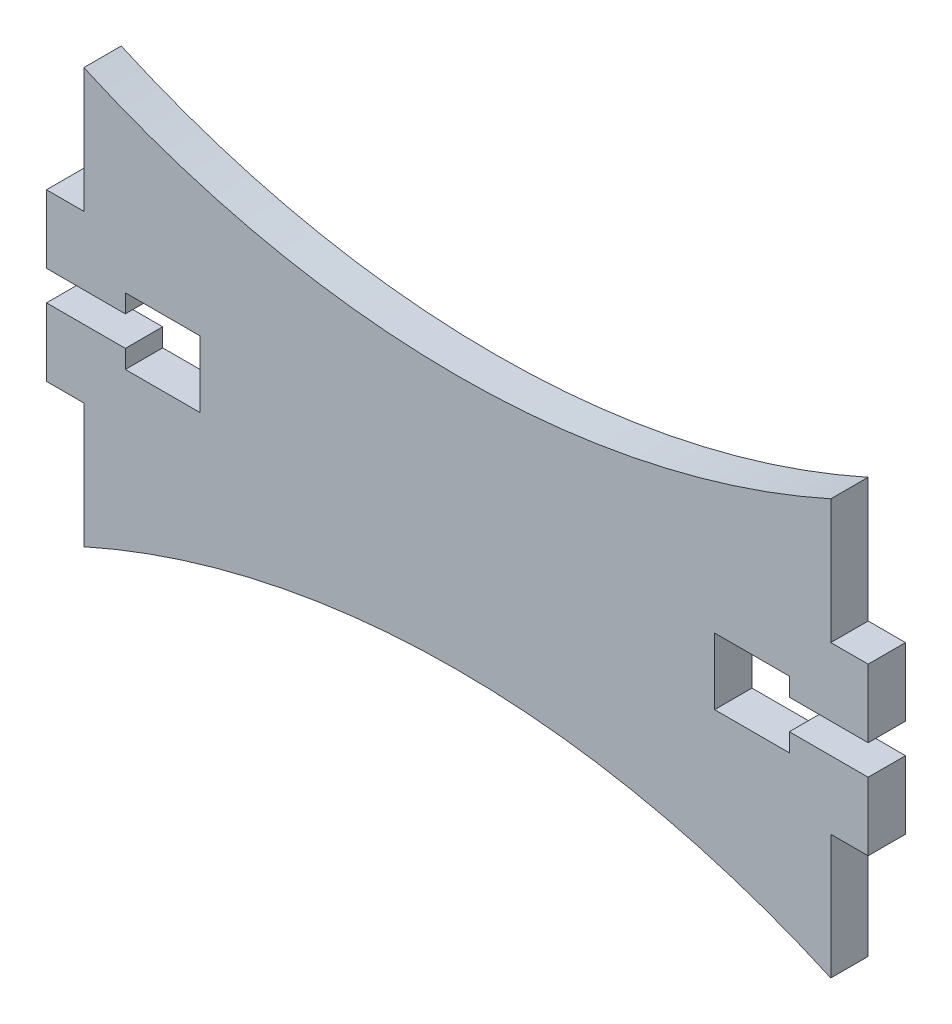
ISO-10303-21;
HEADER;
FILE_DESCRIPTION(('STEP AP214'),'2;1');
FILE_NAME('part.step','',(''),(''),'','','');
FILE_SCHEMA(('AUTOMOTIVE_DESIGN { 1 0 10303 214 1 1 1 1 }'));
ENDSEC;
DATA;
#1=APPLICATION_CONTEXT('core data for automotive mechanical design processes');
#2=APPLICATION_PROTOCOL_DEFINITION('international standard','automotive_design',2000,#1);
#3=PRODUCT_CONTEXT('',#1,'mechanical');
#4=PRODUCT('Part','Part','',(#3));
#5=PRODUCT_RELATED_PRODUCT_CATEGORY('part','',(#4));
#6=PRODUCT_DEFINITION_FORMATION('','',#4);
#7=PRODUCT_DEFINITION_CONTEXT('part definition',#1,'design');
#8=PRODUCT_DEFINITION('design','',#6,#7);
#9=PRODUCT_DEFINITION_SHAPE('','',#8);
#10=(LENGTH_UNIT() NAMED_UNIT(*) SI_UNIT(.MILLI.,.METRE.));
#11=(NAMED_UNIT(*) PLANE_ANGLE_UNIT() SI_UNIT($,.RADIAN.));
#12=(NAMED_UNIT(*) SI_UNIT($,.STERADIAN.) SOLID_ANGLE_UNIT());
#13=UNCERTAINTY_MEASURE_WITH_UNIT(LENGTH_MEASURE(1.E-05),#10,'distance_accuracy_value','');
#14=(GEOMETRIC_REPRESENTATION_CONTEXT(3) GLOBAL_UNCERTAINTY_ASSIGNED_CONTEXT((#13)) GLOBAL_UNIT_ASSIGNED_CONTEXT((#10,
#11,#12)) REPRESENTATION_CONTEXT('',''));
#15=CARTESIAN_POINT('',(0.,0.,0.));
#16=DIRECTION('',(0.,0.,1.));
#17=DIRECTION('',(1.,0.,0.));
#18=AXIS2_PLACEMENT_3D('',#15,#16,#17);
#19=CARTESIAN_POINT('',(-4.44089209850063E-13,125.,4.5));
#20=DIRECTION('',(0.,0.,-1.));
#21=DIRECTION('',(-1.,0.,0.));
#22=AXIS2_PLACEMENT_3D('',#19,#20,#21);
#23=CYLINDRICAL_SURFACE('',#22,109.658560997307);
#24=CARTESIAN_POINT('',(-4.44089209850063E-13,125.,0.));
#25=DIRECTION('',(0.,0.,1.));
#26=DIRECTION('',(1.,0.,0.));
#27=AXIS2_PLACEMENT_3D('',#24,#25,#26);
#28=CIRCLE('',#27,109.658560997307);
#29=CARTESIAN_POINT('',(-45.0000000000004,24.9999999999999,0.));
#30=VERTEX_POINT('',#29);
#31=CARTESIAN_POINT('',(44.9999999999996,24.9999999999999,0.));
#32=VERTEX_POINT('',#31);
#33=EDGE_CURVE('E251',#30,#32,#28,.T.);
#34=ORIENTED_EDGE('',*,*,#33,.F.);
#35=DIRECTION('',(0.,0.,-1.));
#36=VECTOR('',#35,1.);
#37=CARTESIAN_POINT('',(-45.0000000000004,24.9999999999999,4.5));
#38=LINE('',#37,#36);
#39=CARTESIAN_POINT('',(-45.0000000000004,24.9999999999999,4.5));
#40=VERTEX_POINT('',#39);
#41=EDGE_CURVE('E11',#40,#30,#38,.T.);
#42=ORIENTED_EDGE('',*,*,#41,.F.);
#43=CARTESIAN_POINT('',(-4.44089209850063E-13,125.,4.5));
#44=DIRECTION('',(0.,0.,1.));
#45=DIRECTION('',(1.,0.,0.));
#46=AXIS2_PLACEMENT_3D('',#43,#44,#45);
#47=CIRCLE('',#46,109.658560997307);
#48=CARTESIAN_POINT('',(44.9999999999996,24.9999999999999,4.5));
#49=VERTEX_POINT('',#48);
#50=EDGE_CURVE('E321',#40,#49,#47,.T.);
#51=ORIENTED_EDGE('',*,*,#50,.T.);
#52=DIRECTION('',(0.,0.,-1.));
#53=VECTOR('',#52,1.);
#54=CARTESIAN_POINT('',(44.9999999999996,24.9999999999999,4.5));
#55=LINE('',#54,#53);
#56=EDGE_CURVE('E147',#49,#32,#55,.T.);
#57=ORIENTED_EDGE('',*,*,#56,.T.);
#58=EDGE_LOOP('',(#34,#42,#51,#57));
#59=FACE_BOUND('',#58,.T.);
#60=ADVANCED_FACE('F37',(#59),#23,.F.);
#61=CARTESIAN_POINT('',(-45.0000000000004,0.,4.5));
#62=DIRECTION('',(-1.,0.,0.));
#63=DIRECTION('',(0.,0.,1.));
#64=AXIS2_PLACEMENT_3D('',#61,#62,#63);
#65=PLANE('',#64);
#66=DIRECTION('',(0.,1.,0.));
#67=VECTOR('',#66,1.);
#68=CARTESIAN_POINT('',(-45.0000000000004,0.,0.));
#69=LINE('',#68,#67);
#70=CARTESIAN_POINT('',(-45.0000000000004,9.99999999999995,0.));
#71=VERTEX_POINT('',#70);
#72=EDGE_CURVE('E254',#71,#30,#69,.T.);
#73=ORIENTED_EDGE('',*,*,#72,.F.);
#74=DIRECTION('',(0.,0.,-1.));
#75=VECTOR('',#74,1.);
#76=CARTESIAN_POINT('',(-45.0000000000004,9.99999999999995,4.5));
#77=LINE('',#76,#75);
#78=CARTESIAN_POINT('',(-45.0000000000004,9.99999999999995,4.5));
#79=VERTEX_POINT('',#78);
#80=EDGE_CURVE('E45',#79,#71,#77,.T.);
#81=ORIENTED_EDGE('',*,*,#80,.F.);
#82=DIRECTION('',(0.,1.,0.));
#83=VECTOR('',#82,1.);
#84=CARTESIAN_POINT('',(-45.0000000000004,0.,4.5));
#85=LINE('',#84,#83);
#86=EDGE_CURVE('E396',#79,#40,#85,.T.);
#87=ORIENTED_EDGE('',*,*,#86,.T.);
#88=ORIENTED_EDGE('',*,*,#41,.T.);
#89=EDGE_LOOP('',(#73,#81,#87,#88));
#90=FACE_BOUND('',#89,.T.);
#91=ADVANCED_FACE('F384',(#90),#65,.T.);
#92=CARTESIAN_POINT('',(0.,9.99999999999995,4.5));
#93=DIRECTION('',(0.,1.,0.));
#94=DIRECTION('',(0.,0.,1.));
#95=AXIS2_PLACEMENT_3D('',#92,#93,#94);
#96=PLANE('',#95);
#97=DIRECTION('',(1.,0.,0.));
#98=VECTOR('',#97,1.);
#99=CARTESIAN_POINT('',(0.,9.99999999999995,0.));
#100=LINE('',#99,#98);
#101=CARTESIAN_POINT('',(-49.5000000000004,9.99999999999995,0.));
#102=VERTEX_POINT('',#101);
#103=EDGE_CURVE('E257',#102,#71,#100,.T.);
#104=ORIENTED_EDGE('',*,*,#103,.F.);
#105=DIRECTION('',(0.,0.,-1.));
#106=VECTOR('',#105,1.);
#107=CARTESIAN_POINT('',(-49.5000000000004,9.99999999999995,4.5));
#108=LINE('',#107,#106);
#109=CARTESIAN_POINT('',(-49.5000000000004,9.99999999999995,4.5));
#110=VERTEX_POINT('',#109);
#111=EDGE_CURVE('E373',#110,#102,#108,.T.);
#112=ORIENTED_EDGE('',*,*,#111,.F.);
#113=DIRECTION('',(1.,0.,0.));
#114=VECTOR('',#113,1.);
#115=CARTESIAN_POINT('',(0.,9.99999999999995,4.5));
#116=LINE('',#115,#114);
#117=EDGE_CURVE('E380',#110,#79,#116,.T.);
#118=ORIENTED_EDGE('',*,*,#117,.T.);
#119=ORIENTED_EDGE('',*,*,#80,.T.);
#120=EDGE_LOOP('',(#104,#112,#118,#119));
#121=FACE_BOUND('',#120,.T.);
#122=ADVANCED_FACE('F378',(#121),#96,.T.);
#123=CARTESIAN_POINT('',(-49.5000000000004,0.,4.5));
#124=DIRECTION('',(-1.,0.,0.));
#125=DIRECTION('',(0.,0.,1.));
#126=AXIS2_PLACEMENT_3D('',#123,#124,#125);
#127=PLANE('',#126);
#128=DIRECTION('',(0.,1.,0.));
#129=VECTOR('',#128,1.);
#130=CARTESIAN_POINT('',(-49.5000000000004,0.,0.));
#131=LINE('',#130,#129);
#132=CARTESIAN_POINT('',(-49.5000000000004,1.79999999999994,0.));
#133=VERTEX_POINT('',#132);
#134=EDGE_CURVE('E260',#133,#102,#131,.T.);
#135=ORIENTED_EDGE('',*,*,#134,.F.);
#136=DIRECTION('',(0.,0.,-1.));
#137=VECTOR('',#136,1.);
#138=CARTESIAN_POINT('',(-49.5000000000004,1.79999999999994,4.5));
#139=LINE('',#138,#137);
#140=CARTESIAN_POINT('',(-49.5000000000004,1.79999999999994,4.5));
#141=VERTEX_POINT('',#140);
#142=EDGE_CURVE('E371',#141,#133,#139,.T.);
#143=ORIENTED_EDGE('',*,*,#142,.F.);
#144=DIRECTION('',(0.,1.,0.));
#145=VECTOR('',#144,1.);
#146=CARTESIAN_POINT('',(-49.5000000000004,0.,4.5));
#147=LINE('',#146,#145);
#148=EDGE_CURVE('E395',#141,#110,#147,.T.);
#149=ORIENTED_EDGE('',*,*,#148,.T.);
#150=ORIENTED_EDGE('',*,*,#111,.T.);
#151=EDGE_LOOP('',(#135,#143,#149,#150));
#152=FACE_BOUND('',#151,.T.);
#153=ADVANCED_FACE('F391',(#152),#127,.T.);
#154=CARTESIAN_POINT('',(0.,1.79999999999994,4.5));
#155=DIRECTION('',(0.,1.,0.));
#156=DIRECTION('',(0.,0.,1.));
#157=AXIS2_PLACEMENT_3D('',#154,#155,#156);
#158=PLANE('',#157);
#159=DIRECTION('',(1.,0.,0.));
#160=VECTOR('',#159,1.);
#161=CARTESIAN_POINT('',(0.,1.79999999999994,0.));
#162=LINE('',#161,#160);
#163=CARTESIAN_POINT('',(-40.0000000000003,1.79999999999994,0.));
#164=VERTEX_POINT('',#163);
#165=EDGE_CURVE('E263',#133,#164,#162,.T.);
#166=ORIENTED_EDGE('',*,*,#165,.T.);
#167=DIRECTION('',(0.,0.,-1.));
#168=VECTOR('',#167,1.);
#169=CARTESIAN_POINT('',(-40.0000000000003,1.79999999999994,4.5));
#170=LINE('',#169,#168);
#171=CARTESIAN_POINT('',(-40.0000000000003,1.79999999999994,4.5));
#172=VERTEX_POINT('',#171);
#173=EDGE_CURVE('E368',#172,#164,#170,.T.);
#174=ORIENTED_EDGE('',*,*,#173,.F.);
#175=DIRECTION('',(1.,0.,0.));
#176=VECTOR('',#175,1.);
#177=CARTESIAN_POINT('',(0.,1.79999999999994,4.5));
#178=LINE('',#177,#176);
#179=EDGE_CURVE('E398',#141,#172,#178,.T.);
#180=ORIENTED_EDGE('',*,*,#179,.F.);
#181=ORIENTED_EDGE('',*,*,#142,.T.);
#182=EDGE_LOOP('',(#166,#174,#180,#181));
#183=FACE_BOUND('',#182,.T.);
#184=ADVANCED_FACE('F464',(#183),#158,.F.);
#185=CARTESIAN_POINT('',(-40.0000000000003,0.,4.5));
#186=DIRECTION('',(-1.,0.,0.));
#187=DIRECTION('',(0.,0.,1.));
#188=AXIS2_PLACEMENT_3D('',#185,#186,#187);
#189=PLANE('',#188);
#190=DIRECTION('',(0.,1.,0.));
#191=VECTOR('',#190,1.);
#192=CARTESIAN_POINT('',(-40.0000000000003,0.,0.));
#193=LINE('',#192,#191);
#194=CARTESIAN_POINT('',(-40.0000000000003,3.99999999999993,0.));
#195=VERTEX_POINT('',#194);
#196=EDGE_CURVE('E265',#164,#195,#193,.T.);
#197=ORIENTED_EDGE('',*,*,#196,.T.);
#198=DIRECTION('',(0.,0.,-1.));
#199=VECTOR('',#198,1.);
#200=CARTESIAN_POINT('',(-40.0000000000003,3.99999999999993,4.5));
#201=LINE('',#200,#199);
#202=CARTESIAN_POINT('',(-40.0000000000003,3.99999999999993,4.5));
#203=VERTEX_POINT('',#202);
#204=EDGE_CURVE('E366',#203,#195,#201,.T.);
#205=ORIENTED_EDGE('',*,*,#204,.F.);
#206=DIRECTION('',(0.,1.,0.));
#207=VECTOR('',#206,1.);
#208=CARTESIAN_POINT('',(-40.0000000000003,0.,4.5));
#209=LINE('',#208,#207);
#210=EDGE_CURVE('E404',#172,#203,#209,.T.);
#211=ORIENTED_EDGE('',*,*,#210,.F.);
#212=ORIENTED_EDGE('',*,*,#173,.T.);
#213=EDGE_LOOP('',(#197,#205,#211,#212));
#214=FACE_BOUND('',#213,.T.);
#215=ADVANCED_FACE('F472',(#214),#189,.F.);
#216=CARTESIAN_POINT('',(0.,3.99999999999994,4.5));
#217=DIRECTION('',(0.,-1.,0.));
#218=DIRECTION('',(1.,0.,0.));
#219=AXIS2_PLACEMENT_3D('',#216,#217,#218);
#220=PLANE('',#219);
#221=DIRECTION('',(-1.,0.,0.));
#222=VECTOR('',#221,1.);
#223=CARTESIAN_POINT('',(0.,3.99999999999994,0.));
#224=LINE('',#223,#222);
#225=CARTESIAN_POINT('',(-31.0000000000003,3.99999999999993,0.));
#226=VERTEX_POINT('',#225);
#227=EDGE_CURVE('E269',#226,#195,#224,.T.);
#228=ORIENTED_EDGE('',*,*,#227,.F.);
#229=DIRECTION('',(0.,0.,-1.));
#230=VECTOR('',#229,1.);
#231=CARTESIAN_POINT('',(-31.0000000000003,3.99999999999993,4.5));
#232=LINE('',#231,#230);
#233=CARTESIAN_POINT('',(-31.0000000000003,3.99999999999993,4.5));
#234=VERTEX_POINT('',#233);
#235=EDGE_CURVE('E364',#234,#226,#232,.T.);
#236=ORIENTED_EDGE('',*,*,#235,.F.);
#237=DIRECTION('',(-1.,0.,0.));
#238=VECTOR('',#237,1.);
#239=CARTESIAN_POINT('',(0.,3.99999999999994,4.5));
#240=LINE('',#239,#238);
#241=EDGE_CURVE('E406',#234,#203,#240,.T.);
#242=ORIENTED_EDGE('',*,*,#241,.T.);
#243=ORIENTED_EDGE('',*,*,#204,.T.);
#244=EDGE_LOOP('',(#228,#236,#242,#243));
#245=FACE_BOUND('',#244,.T.);
#246=ADVANCED_FACE('F710',(#245),#220,.T.);
#247=CARTESIAN_POINT('',(-31.0000000000003,0.,4.5));
#248=DIRECTION('',(-1.,0.,0.));
#249=DIRECTION('',(0.,0.,1.));
#250=AXIS2_PLACEMENT_3D('',#247,#248,#249);
#251=PLANE('',#250);
#252=DIRECTION('',(0.,1.,0.));
#253=VECTOR('',#252,1.);
#254=CARTESIAN_POINT('',(-31.0000000000003,0.,0.));
#255=LINE('',#254,#253);
#256=CARTESIAN_POINT('',(-31.0000000000003,-4.00000000000007,0.));
#257=VERTEX_POINT('',#256);
#258=EDGE_CURVE('E272',#257,#226,#255,.T.);
#259=ORIENTED_EDGE('',*,*,#258,.F.);
#260=DIRECTION('',(0.,0.,-1.));
#261=VECTOR('',#260,1.);
#262=CARTESIAN_POINT('',(-31.0000000000003,-4.00000000000007,4.5));
#263=LINE('',#262,#261);
#264=CARTESIAN_POINT('',(-31.0000000000003,-4.00000000000007,4.5));
#265=VERTEX_POINT('',#264);
#266=EDGE_CURVE('E362',#265,#257,#263,.T.);
#267=ORIENTED_EDGE('',*,*,#266,.F.);
#268=DIRECTION('',(0.,1.,0.));
#269=VECTOR('',#268,1.);
#270=CARTESIAN_POINT('',(-31.0000000000003,0.,4.5));
#271=LINE('',#270,#269);
#272=EDGE_CURVE('E409',#265,#234,#271,.T.);
#273=ORIENTED_EDGE('',*,*,#272,.T.);
#274=ORIENTED_EDGE('',*,*,#235,.T.);
#275=EDGE_LOOP('',(#259,#267,#273,#274));
#276=FACE_BOUND('',#275,.T.);
#277=ADVANCED_FACE('F700',(#276),#251,.T.);
#278=CARTESIAN_POINT('',(0.,-4.00000000000006,4.5));
#279=DIRECTION('',(0.,-1.,0.));
#280=DIRECTION('',(1.,0.,0.));
#281=AXIS2_PLACEMENT_3D('',#278,#279,#280);
#282=PLANE('',#281);
#283=DIRECTION('',(-1.,0.,0.));
#284=VECTOR('',#283,1.);
#285=CARTESIAN_POINT('',(0.,-4.00000000000006,0.));
#286=LINE('',#285,#284);
#287=CARTESIAN_POINT('',(-40.0000000000003,-4.00000000000007,0.));
#288=VERTEX_POINT('',#287);
#289=EDGE_CURVE('E275',#257,#288,#286,.T.);
#290=ORIENTED_EDGE('',*,*,#289,.T.);
#291=DIRECTION('',(0.,0.,-1.));
#292=VECTOR('',#291,1.);
#293=CARTESIAN_POINT('',(-40.0000000000003,-4.00000000000007,4.5));
#294=LINE('',#293,#292);
#295=CARTESIAN_POINT('',(-40.0000000000003,-4.00000000000007,4.5));
#296=VERTEX_POINT('',#295);
#297=EDGE_CURVE('E359',#296,#288,#294,.T.);
#298=ORIENTED_EDGE('',*,*,#297,.F.);
#299=DIRECTION('',(-1.,0.,0.));
#300=VECTOR('',#299,1.);
#301=CARTESIAN_POINT('',(0.,-4.00000000000006,4.5));
#302=LINE('',#301,#300);
#303=EDGE_CURVE('E412',#265,#296,#302,.T.);
#304=ORIENTED_EDGE('',*,*,#303,.F.);
#305=ORIENTED_EDGE('',*,*,#266,.T.);
#306=EDGE_LOOP('',(#290,#298,#304,#305));
#307=FACE_BOUND('',#306,.T.);
#308=ADVANCED_FACE('F690',(#307),#282,.F.);
#309=CARTESIAN_POINT('',(-40.0000000000003,0.,4.5));
#310=DIRECTION('',(-1.,0.,0.));
#311=DIRECTION('',(0.,0.,1.));
#312=AXIS2_PLACEMENT_3D('',#309,#310,#311);
#313=PLANE('',#312);
#314=DIRECTION('',(0.,1.,0.));
#315=VECTOR('',#314,1.);
#316=CARTESIAN_POINT('',(-40.0000000000003,0.,0.));
#317=LINE('',#316,#315);
#318=CARTESIAN_POINT('',(-40.0000000000003,-1.80000000000006,0.));
#319=VERTEX_POINT('',#318);
#320=EDGE_CURVE('E277',#288,#319,#317,.T.);
#321=ORIENTED_EDGE('',*,*,#320,.T.);
#322=DIRECTION('',(0.,0.,-1.));
#323=VECTOR('',#322,1.);
#324=CARTESIAN_POINT('',(-40.0000000000003,-1.80000000000006,4.5));
#325=LINE('',#324,#323);
#326=CARTESIAN_POINT('',(-40.0000000000003,-1.80000000000006,4.5));
#327=VERTEX_POINT('',#326);
#328=EDGE_CURVE('E357',#327,#319,#325,.T.);
#329=ORIENTED_EDGE('',*,*,#328,.F.);
#330=DIRECTION('',(0.,1.,0.));
#331=VECTOR('',#330,1.);
#332=CARTESIAN_POINT('',(-40.0000000000003,0.,4.5));
#333=LINE('',#332,#331);
#334=EDGE_CURVE('E414',#296,#327,#333,.T.);
#335=ORIENTED_EDGE('',*,*,#334,.F.);
#336=ORIENTED_EDGE('',*,*,#297,.T.);
#337=EDGE_LOOP('',(#321,#329,#335,#336));
#338=FACE_BOUND('',#337,.T.);
#339=ADVANCED_FACE('F681',(#338),#313,.F.);
#340=CARTESIAN_POINT('',(0.,-1.80000000000006,4.5));
#341=DIRECTION('',(0.,1.,0.));
#342=DIRECTION('',(0.,0.,1.));
#343=AXIS2_PLACEMENT_3D('',#340,#341,#342);
#344=PLANE('',#343);
#345=DIRECTION('',(1.,0.,0.));
#346=VECTOR('',#345,1.);
#347=CARTESIAN_POINT('',(0.,-1.80000000000006,0.));
#348=LINE('',#347,#346);
#349=CARTESIAN_POINT('',(-49.5000000000004,-1.80000000000006,0.));
#350=VERTEX_POINT('',#349);
#351=EDGE_CURVE('E280',#350,#319,#348,.T.);
#352=ORIENTED_EDGE('',*,*,#351,.F.);
#353=DIRECTION('',(0.,0.,-1.));
#354=VECTOR('',#353,1.);
#355=CARTESIAN_POINT('',(-49.5000000000004,-1.80000000000006,4.5));
#356=LINE('',#355,#354);
#357=CARTESIAN_POINT('',(-49.5000000000004,-1.80000000000006,4.5));
#358=VERTEX_POINT('',#357);
#359=EDGE_CURVE('E355',#358,#350,#356,.T.);
#360=ORIENTED_EDGE('',*,*,#359,.F.);
#361=DIRECTION('',(1.,0.,0.));
#362=VECTOR('',#361,1.);
#363=CARTESIAN_POINT('',(0.,-1.80000000000006,4.5));
#364=LINE('',#363,#362);
#365=EDGE_CURVE('E416',#358,#327,#364,.T.);
#366=ORIENTED_EDGE('',*,*,#365,.T.);
#367=ORIENTED_EDGE('',*,*,#328,.T.);
#368=EDGE_LOOP('',(#352,#360,#366,#367));
#369=FACE_BOUND('',#368,.T.);
#370=ADVANCED_FACE('F604',(#369),#344,.T.);
#371=CARTESIAN_POINT('',(-49.5000000000004,0.,4.5));
#372=DIRECTION('',(-1.,0.,0.));
#373=DIRECTION('',(0.,0.,1.));
#374=AXIS2_PLACEMENT_3D('',#371,#372,#373);
#375=PLANE('',#374);
#376=DIRECTION('',(0.,1.,0.));
#377=VECTOR('',#376,1.);
#378=CARTESIAN_POINT('',(-49.5000000000004,0.,0.));
#379=LINE('',#378,#377);
#380=CARTESIAN_POINT('',(-49.5000000000004,-10.0000000000001,0.));
#381=VERTEX_POINT('',#380);
#382=EDGE_CURVE('E283',#381,#350,#379,.T.);
#383=ORIENTED_EDGE('',*,*,#382,.F.);
#384=DIRECTION('',(0.,0.,-1.));
#385=VECTOR('',#384,1.);
#386=CARTESIAN_POINT('',(-49.5000000000004,-10.0000000000001,4.5));
#387=LINE('',#386,#385);
#388=CARTESIAN_POINT('',(-49.5000000000004,-10.0000000000001,4.5));
#389=VERTEX_POINT('',#388);
#390=EDGE_CURVE('E353',#389,#381,#387,.T.);
#391=ORIENTED_EDGE('',*,*,#390,.F.);
#392=DIRECTION('',(0.,1.,0.));
#393=VECTOR('',#392,1.);
#394=CARTESIAN_POINT('',(-49.5000000000004,0.,4.5));
#395=LINE('',#394,#393);
#396=EDGE_CURVE('E419',#389,#358,#395,.T.);
#397=ORIENTED_EDGE('',*,*,#396,.T.);
#398=ORIENTED_EDGE('',*,*,#359,.T.);
#399=EDGE_LOOP('',(#383,#391,#397,#398));
#400=FACE_BOUND('',#399,.T.);
#401=ADVANCED_FACE('F662',(#400),#375,.T.);
#402=CARTESIAN_POINT('',(0.,-10.0000000000001,4.5));
#403=DIRECTION('',(0.,1.,0.));
#404=DIRECTION('',(0.,0.,1.));
#405=AXIS2_PLACEMENT_3D('',#402,#403,#404);
#406=PLANE('',#405);
#407=DIRECTION('',(1.,0.,0.));
#408=VECTOR('',#407,1.);
#409=CARTESIAN_POINT('',(0.,-10.0000000000001,0.));
#410=LINE('',#409,#408);
#411=CARTESIAN_POINT('',(-45.0000000000004,-10.0000000000001,0.));
#412=VERTEX_POINT('',#411);
#413=EDGE_CURVE('E287',#381,#412,#410,.T.);
#414=ORIENTED_EDGE('',*,*,#413,.T.);
#415=DIRECTION('',(0.,0.,-1.));
#416=VECTOR('',#415,1.);
#417=CARTESIAN_POINT('',(-45.0000000000004,-10.0000000000001,4.5));
#418=LINE('',#417,#416);
#419=CARTESIAN_POINT('',(-45.0000000000004,-10.0000000000001,4.5));
#420=VERTEX_POINT('',#419);
#421=EDGE_CURVE('E351',#420,#412,#418,.T.);
#422=ORIENTED_EDGE('',*,*,#421,.F.);
#423=DIRECTION('',(1.,0.,0.));
#424=VECTOR('',#423,1.);
#425=CARTESIAN_POINT('',(0.,-10.0000000000001,4.5));
#426=LINE('',#425,#424);
#427=EDGE_CURVE('E423',#389,#420,#426,.T.);
#428=ORIENTED_EDGE('',*,*,#427,.F.);
#429=ORIENTED_EDGE('',*,*,#390,.T.);
#430=EDGE_LOOP('',(#414,#422,#428,#429));
#431=FACE_BOUND('',#430,.T.);
#432=ADVANCED_FACE('F652',(#431),#406,.F.);
#433=CARTESIAN_POINT('',(-45.0000000000004,0.,4.5));
#434=DIRECTION('',(-1.,0.,0.));
#435=DIRECTION('',(0.,0.,1.));
#436=AXIS2_PLACEMENT_3D('',#433,#434,#435);
#437=PLANE('',#436);
#438=DIRECTION('',(0.,1.,0.));
#439=VECTOR('',#438,1.);
#440=CARTESIAN_POINT('',(-45.0000000000004,0.,0.));
#441=LINE('',#440,#439);
#442=CARTESIAN_POINT('',(-45.0000000000004,-25.0000000000001,0.));
#443=VERTEX_POINT('',#442);
#444=EDGE_CURVE('E290',#443,#412,#441,.T.);
#445=ORIENTED_EDGE('',*,*,#444,.F.);
#446=DIRECTION('',(0.,0.,-1.));
#447=VECTOR('',#446,1.);
#448=CARTESIAN_POINT('',(-45.0000000000004,-25.0000000000001,4.5));
#449=LINE('',#448,#447);
#450=CARTESIAN_POINT('',(-45.0000000000004,-25.0000000000001,4.5));
#451=VERTEX_POINT('',#450);
#452=EDGE_CURVE('E349',#451,#443,#449,.T.);
#453=ORIENTED_EDGE('',*,*,#452,.F.);
#454=DIRECTION('',(0.,1.,0.));
#455=VECTOR('',#454,1.);
#456=CARTESIAN_POINT('',(-45.0000000000004,0.,4.5));
#457=LINE('',#456,#455);
#458=EDGE_CURVE('E425',#451,#420,#457,.T.);
#459=ORIENTED_EDGE('',*,*,#458,.T.);
#460=ORIENTED_EDGE('',*,*,#421,.T.);
#461=EDGE_LOOP('',(#445,#453,#459,#460));
#462=FACE_BOUND('',#461,.T.);
#463=ADVANCED_FACE('F642',(#462),#437,.T.);
#464=CARTESIAN_POINT('',(-4.44089209850063E-13,-125.,4.5));
#465=DIRECTION('',(0.,0.,-1.));
#466=DIRECTION('',(-1.,0.,0.));
#467=AXIS2_PLACEMENT_3D('',#464,#465,#466);
#468=CYLINDRICAL_SURFACE('',#467,109.658560997307);
#469=CARTESIAN_POINT('',(-4.44089209850063E-13,-125.,0.));
#470=DIRECTION('',(0.,0.,1.));
#471=DIRECTION('',(1.,0.,0.));
#472=AXIS2_PLACEMENT_3D('',#469,#470,#471);
#473=CIRCLE('',#472,109.658560997307);
#474=CARTESIAN_POINT('',(44.9999999999996,-25.0000000000001,0.));
#475=VERTEX_POINT('',#474);
#476=EDGE_CURVE('E293',#443,#475,#473,.F.);
#477=ORIENTED_EDGE('',*,*,#476,.T.);
#478=DIRECTION('',(0.,0.,-1.));
#479=VECTOR('',#478,1.);
#480=CARTESIAN_POINT('',(44.9999999999996,-25.0000000000001,4.5));
#481=LINE('',#480,#479);
#482=CARTESIAN_POINT('',(44.9999999999996,-25.0000000000001,4.5));
#483=VERTEX_POINT('',#482);
#484=EDGE_CURVE('E346',#483,#475,#481,.T.);
#485=ORIENTED_EDGE('',*,*,#484,.F.);
#486=CARTESIAN_POINT('',(-4.44089209850063E-13,-125.,4.5));
#487=DIRECTION('',(0.,0.,1.));
#488=DIRECTION('',(1.,0.,0.));
#489=AXIS2_PLACEMENT_3D('',#486,#487,#488);
#490=CIRCLE('',#489,109.658560997307);
#491=EDGE_CURVE('E428',#451,#483,#490,.F.);
#492=ORIENTED_EDGE('',*,*,#491,.F.);
#493=ORIENTED_EDGE('',*,*,#452,.T.);
#494=EDGE_LOOP('',(#477,#485,#492,#493));
#495=FACE_BOUND('',#494,.T.);
#496=ADVANCED_FACE('F632',(#495),#468,.F.);
#497=CARTESIAN_POINT('',(44.9999999999996,0.,4.5));
#498=DIRECTION('',(-1.,0.,0.));
#499=DIRECTION('',(0.,0.,1.));
#500=AXIS2_PLACEMENT_3D('',#497,#498,#499);
#501=PLANE('',#500);
#502=DIRECTION('',(0.,1.,0.));
#503=VECTOR('',#502,1.);
#504=CARTESIAN_POINT('',(44.9999999999996,0.,0.));
#505=LINE('',#504,#503);
#506=CARTESIAN_POINT('',(44.9999999999996,-10.0000000000001,0.));
#507=VERTEX_POINT('',#506);
#508=EDGE_CURVE('E295',#475,#507,#505,.T.);
#509=ORIENTED_EDGE('',*,*,#508,.T.);
#510=DIRECTION('',(0.,0.,-1.));
#511=VECTOR('',#510,1.);
#512=CARTESIAN_POINT('',(44.9999999999996,-10.0000000000001,4.5));
#513=LINE('',#512,#511);
#514=CARTESIAN_POINT('',(44.9999999999996,-10.0000000000001,4.5));
#515=VERTEX_POINT('',#514);
#516=EDGE_CURVE('E343',#515,#507,#513,.T.);
#517=ORIENTED_EDGE('',*,*,#516,.F.);
#518=DIRECTION('',(0.,1.,0.));
#519=VECTOR('',#518,1.);
#520=CARTESIAN_POINT('',(44.9999999999996,0.,4.5));
#521=LINE('',#520,#519);
#522=EDGE_CURVE('E430',#483,#515,#521,.T.);
#523=ORIENTED_EDGE('',*,*,#522,.F.);
#524=ORIENTED_EDGE('',*,*,#484,.T.);
#525=EDGE_LOOP('',(#509,#517,#523,#524));
#526=FACE_BOUND('',#525,.T.);
#527=ADVANCED_FACE('F622',(#526),#501,.F.);
#528=CARTESIAN_POINT('',(0.,-10.0000000000001,4.5));
#529=DIRECTION('',(0.,1.,0.));
#530=DIRECTION('',(0.,0.,1.));
#531=AXIS2_PLACEMENT_3D('',#528,#529,#530);
#532=PLANE('',#531);
#533=DIRECTION('',(1.,0.,0.));
#534=VECTOR('',#533,1.);
#535=CARTESIAN_POINT('',(0.,-10.0000000000001,0.));
#536=LINE('',#535,#534);
#537=CARTESIAN_POINT('',(49.4999999999996,-10.0000000000001,0.));
#538=VERTEX_POINT('',#537);
#539=EDGE_CURVE('E297',#507,#538,#536,.T.);
#540=ORIENTED_EDGE('',*,*,#539,.T.);
#541=DIRECTION('',(0.,0.,-1.));
#542=VECTOR('',#541,1.);
#543=CARTESIAN_POINT('',(49.4999999999996,-10.0000000000001,4.5));
#544=LINE('',#543,#542);
#545=CARTESIAN_POINT('',(49.4999999999996,-10.0000000000001,4.5));
#546=VERTEX_POINT('',#545);
#547=EDGE_CURVE('E340',#546,#538,#544,.T.);
#548=ORIENTED_EDGE('',*,*,#547,.F.);
#549=DIRECTION('',(1.,0.,0.));
#550=VECTOR('',#549,1.);
#551=CARTESIAN_POINT('',(0.,-10.0000000000001,4.5));
#552=LINE('',#551,#550);
#553=EDGE_CURVE('E432',#515,#546,#552,.T.);
#554=ORIENTED_EDGE('',*,*,#553,.F.);
#555=ORIENTED_EDGE('',*,*,#516,.T.);
#556=EDGE_LOOP('',(#540,#548,#554,#555));
#557=FACE_BOUND('',#556,.T.);
#558=ADVANCED_FACE('F612',(#557),#532,.F.);
#559=CARTESIAN_POINT('',(49.4999999999996,0.,4.5));
#560=DIRECTION('',(-1.,0.,0.));
#561=DIRECTION('',(0.,0.,1.));
#562=AXIS2_PLACEMENT_3D('',#559,#560,#561);
#563=PLANE('',#562);
#564=DIRECTION('',(0.,1.,0.));
#565=VECTOR('',#564,1.);
#566=CARTESIAN_POINT('',(49.4999999999996,0.,0.));
#567=LINE('',#566,#565);
#568=CARTESIAN_POINT('',(49.4999999999996,-1.80000000000006,0.));
#569=VERTEX_POINT('',#568);
#570=EDGE_CURVE('E299',#538,#569,#567,.T.);
#571=ORIENTED_EDGE('',*,*,#570,.T.);
#572=DIRECTION('',(0.,0.,-1.));
#573=VECTOR('',#572,1.);
#574=CARTESIAN_POINT('',(49.4999999999996,-1.80000000000006,4.5));
#575=LINE('',#574,#573);
#576=CARTESIAN_POINT('',(49.4999999999996,-1.80000000000006,4.5));
#577=VERTEX_POINT('',#576);
#578=EDGE_CURVE('E338',#577,#569,#575,.T.);
#579=ORIENTED_EDGE('',*,*,#578,.F.);
#580=DIRECTION('',(0.,1.,0.));
#581=VECTOR('',#580,1.);
#582=CARTESIAN_POINT('',(49.4999999999996,0.,4.5));
#583=LINE('',#582,#581);
#584=EDGE_CURVE('E434',#546,#577,#583,.T.);
#585=ORIENTED_EDGE('',*,*,#584,.F.);
#586=ORIENTED_EDGE('',*,*,#547,.T.);
#587=EDGE_LOOP('',(#571,#579,#585,#586));
#588=FACE_BOUND('',#587,.T.);
#589=ADVANCED_FACE('F601',(#588),#563,.F.);
#590=CARTESIAN_POINT('',(39.9999999999996,-1.80000000000006,0.));
#591=VERTEX_POINT('',#590);
#592=EDGE_CURVE('E284',#591,#569,#348,.T.);
#593=ORIENTED_EDGE('',*,*,#592,.F.);
#594=DIRECTION('',(0.,0.,-1.));
#595=VECTOR('',#594,1.);
#596=CARTESIAN_POINT('',(39.9999999999996,-1.80000000000006,4.5));
#597=LINE('',#596,#595);
#598=CARTESIAN_POINT('',(39.9999999999996,-1.80000000000006,4.5));
#599=VERTEX_POINT('',#598);
#600=EDGE_CURVE('E336',#599,#591,#597,.T.);
#601=ORIENTED_EDGE('',*,*,#600,.F.);
#602=EDGE_CURVE('E420',#599,#577,#364,.T.);
#603=ORIENTED_EDGE('',*,*,#602,.T.);
#604=ORIENTED_EDGE('',*,*,#578,.T.);
#605=EDGE_LOOP('',(#593,#601,#603,#604));
#606=FACE_BOUND('',#605,.T.);
#607=ADVANCED_FACE('F591',(#606),#344,.T.);
#608=CARTESIAN_POINT('',(39.9999999999996,0.,4.5));
#609=DIRECTION('',(-1.,0.,0.));
#610=DIRECTION('',(0.,0.,1.));
#611=AXIS2_PLACEMENT_3D('',#608,#609,#610);
#612=PLANE('',#611);
#613=DIRECTION('',(0.,1.,0.));
#614=VECTOR('',#613,1.);
#615=CARTESIAN_POINT('',(39.9999999999996,0.,0.));
#616=LINE('',#615,#614);
#617=CARTESIAN_POINT('',(39.9999999999996,-4.00000000000005,0.));
#618=VERTEX_POINT('',#617);
#619=EDGE_CURVE('E302',#618,#591,#616,.T.);
#620=ORIENTED_EDGE('',*,*,#619,.F.);
#621=DIRECTION('',(0.,0.,-1.));
#622=VECTOR('',#621,1.);
#623=CARTESIAN_POINT('',(39.9999999999996,-4.00000000000005,4.5));
#624=LINE('',#623,#622);
#625=CARTESIAN_POINT('',(39.9999999999996,-4.00000000000005,4.5));
#626=VERTEX_POINT('',#625);
#627=EDGE_CURVE('E334',#626,#618,#624,.T.);
#628=ORIENTED_EDGE('',*,*,#627,.F.);
#629=DIRECTION('',(0.,1.,0.));
#630=VECTOR('',#629,1.);
#631=CARTESIAN_POINT('',(39.9999999999996,0.,4.5));
#632=LINE('',#631,#630);
#633=EDGE_CURVE('E436',#626,#599,#632,.T.);
#634=ORIENTED_EDGE('',*,*,#633,.T.);
#635=ORIENTED_EDGE('',*,*,#600,.T.);
#636=EDGE_LOOP('',(#620,#628,#634,#635));
#637=FACE_BOUND('',#636,.T.);
#638=ADVANCED_FACE('F581',(#637),#612,.T.);
#639=CARTESIAN_POINT('',(0.,-4.00000000000005,4.5));
#640=DIRECTION('',(0.,1.,0.));
#641=DIRECTION('',(0.,0.,1.));
#642=AXIS2_PLACEMENT_3D('',#639,#640,#641);
#643=PLANE('',#642);
#644=DIRECTION('',(1.,0.,0.));
#645=VECTOR('',#644,1.);
#646=CARTESIAN_POINT('',(0.,-4.00000000000005,0.));
#647=LINE('',#646,#645);
#648=CARTESIAN_POINT('',(30.9999999999996,-4.00000000000005,0.));
#649=VERTEX_POINT('',#648);
#650=EDGE_CURVE('E305',#649,#618,#647,.T.);
#651=ORIENTED_EDGE('',*,*,#650,.F.);
#652=DIRECTION('',(0.,0.,-1.));
#653=VECTOR('',#652,1.);
#654=CARTESIAN_POINT('',(30.9999999999996,-4.00000000000005,4.5));
#655=LINE('',#654,#653);
#656=CARTESIAN_POINT('',(30.9999999999996,-4.00000000000005,4.5));
#657=VERTEX_POINT('',#656);
#658=EDGE_CURVE('E332',#657,#649,#655,.T.);
#659=ORIENTED_EDGE('',*,*,#658,.F.);
#660=DIRECTION('',(1.,0.,0.));
#661=VECTOR('',#660,1.);
#662=CARTESIAN_POINT('',(0.,-4.00000000000005,4.5));
#663=LINE('',#662,#661);
#664=EDGE_CURVE('E439',#657,#626,#663,.T.);
#665=ORIENTED_EDGE('',*,*,#664,.T.);
#666=ORIENTED_EDGE('',*,*,#627,.T.);
#667=EDGE_LOOP('',(#651,#659,#665,#666));
#668=FACE_BOUND('',#667,.T.);
#669=ADVANCED_FACE('F571',(#668),#643,.T.);
#670=CARTESIAN_POINT('',(30.9999999999996,0.,4.5));
#671=DIRECTION('',(-1.,0.,0.));
#672=DIRECTION('',(0.,0.,1.));
#673=AXIS2_PLACEMENT_3D('',#670,#671,#672);
#674=PLANE('',#673);
#675=DIRECTION('',(0.,1.,0.));
#676=VECTOR('',#675,1.);
#677=CARTESIAN_POINT('',(30.9999999999996,0.,0.));
#678=LINE('',#677,#676);
#679=CARTESIAN_POINT('',(30.9999999999996,3.99999999999995,0.));
#680=VERTEX_POINT('',#679);
#681=EDGE_CURVE('E308',#649,#680,#678,.T.);
#682=ORIENTED_EDGE('',*,*,#681,.T.);
#683=DIRECTION('',(0.,0.,-1.));
#684=VECTOR('',#683,1.);
#685=CARTESIAN_POINT('',(30.9999999999996,3.99999999999995,4.5));
#686=LINE('',#685,#684);
#687=CARTESIAN_POINT('',(30.9999999999996,3.99999999999995,4.5));
#688=VERTEX_POINT('',#687);
#689=EDGE_CURVE('E329',#688,#680,#686,.T.);
#690=ORIENTED_EDGE('',*,*,#689,.F.);
#691=DIRECTION('',(0.,1.,0.));
#692=VECTOR('',#691,1.);
#693=CARTESIAN_POINT('',(30.9999999999996,0.,4.5));
#694=LINE('',#693,#692);
#695=EDGE_CURVE('E442',#657,#688,#694,.T.);
#696=ORIENTED_EDGE('',*,*,#695,.F.);
#697=ORIENTED_EDGE('',*,*,#658,.T.);
#698=EDGE_LOOP('',(#682,#690,#696,#697));
#699=FACE_BOUND('',#698,.T.);
#700=ADVANCED_FACE('F562',(#699),#674,.F.);
#701=CARTESIAN_POINT('',(0.,3.99999999999995,4.5));
#702=DIRECTION('',(0.,1.,0.));
#703=DIRECTION('',(0.,0.,1.));
#704=AXIS2_PLACEMENT_3D('',#701,#702,#703);
#705=PLANE('',#704);
#706=DIRECTION('',(1.,0.,0.));
#707=VECTOR('',#706,1.);
#708=CARTESIAN_POINT('',(0.,3.99999999999995,0.));
#709=LINE('',#708,#707);
#710=CARTESIAN_POINT('',(39.9999999999996,3.99999999999995,0.));
#711=VERTEX_POINT('',#710);
#712=EDGE_CURVE('E310',#680,#711,#709,.T.);
#713=ORIENTED_EDGE('',*,*,#712,.T.);
#714=DIRECTION('',(0.,0.,-1.));
#715=VECTOR('',#714,1.);
#716=CARTESIAN_POINT('',(39.9999999999996,3.99999999999995,4.5));
#717=LINE('',#716,#715);
#718=CARTESIAN_POINT('',(39.9999999999996,3.99999999999995,4.5));
#719=VERTEX_POINT('',#718);
#720=EDGE_CURVE('E327',#719,#711,#717,.T.);
#721=ORIENTED_EDGE('',*,*,#720,.F.);
#722=DIRECTION('',(1.,0.,0.));
#723=VECTOR('',#722,1.);
#724=CARTESIAN_POINT('',(0.,3.99999999999995,4.5));
#725=LINE('',#724,#723);
#726=EDGE_CURVE('E444',#688,#719,#725,.T.);
#727=ORIENTED_EDGE('',*,*,#726,.F.);
#728=ORIENTED_EDGE('',*,*,#689,.T.);
#729=EDGE_LOOP('',(#713,#721,#727,#728));
#730=FACE_BOUND('',#729,.T.);
#731=ADVANCED_FACE('F456',(#730),#705,.F.);
#732=CARTESIAN_POINT('',(39.9999999999996,0.,4.5));
#733=DIRECTION('',(-1.,0.,0.));
#734=DIRECTION('',(0.,0.,1.));
#735=AXIS2_PLACEMENT_3D('',#732,#733,#734);
#736=PLANE('',#735);
#737=DIRECTION('',(0.,1.,0.));
#738=VECTOR('',#737,1.);
#739=CARTESIAN_POINT('',(39.9999999999996,0.,0.));
#740=LINE('',#739,#738);
#741=CARTESIAN_POINT('',(39.9999999999996,1.79999999999994,0.));
#742=VERTEX_POINT('',#741);
#743=EDGE_CURVE('E313',#742,#711,#740,.T.);
#744=ORIENTED_EDGE('',*,*,#743,.F.);
#745=DIRECTION('',(0.,0.,-1.));
#746=VECTOR('',#745,1.);
#747=CARTESIAN_POINT('',(39.9999999999996,1.79999999999994,4.5));
#748=LINE('',#747,#746);
#749=CARTESIAN_POINT('',(39.9999999999996,1.79999999999994,4.5));
#750=VERTEX_POINT('',#749);
#751=EDGE_CURVE('E325',#750,#742,#748,.T.);
#752=ORIENTED_EDGE('',*,*,#751,.F.);
#753=DIRECTION('',(0.,1.,0.));
#754=VECTOR('',#753,1.);
#755=CARTESIAN_POINT('',(39.9999999999996,0.,4.5));
#756=LINE('',#755,#754);
#757=EDGE_CURVE('E445',#750,#719,#756,.T.);
#758=ORIENTED_EDGE('',*,*,#757,.T.);
#759=ORIENTED_EDGE('',*,*,#720,.T.);
#760=EDGE_LOOP('',(#744,#752,#758,#759));
#761=FACE_BOUND('',#760,.T.);
#762=ADVANCED_FACE('F449',(#761),#736,.T.);
#763=CARTESIAN_POINT('',(49.4999999999996,1.79999999999994,0.));
#764=VERTEX_POINT('',#763);
#765=EDGE_CURVE('E266',#742,#764,#162,.T.);
#766=ORIENTED_EDGE('',*,*,#765,.T.);
#767=DIRECTION('',(0.,0.,-1.));
#768=VECTOR('',#767,1.);
#769=CARTESIAN_POINT('',(49.4999999999996,1.79999999999994,4.5));
#770=LINE('',#769,#768);
#771=CARTESIAN_POINT('',(49.4999999999996,1.79999999999994,4.5));
#772=VERTEX_POINT('',#771);
#773=EDGE_CURVE('E244',#772,#764,#770,.T.);
#774=ORIENTED_EDGE('',*,*,#773,.F.);
#775=EDGE_CURVE('E231',#750,#772,#178,.T.);
#776=ORIENTED_EDGE('',*,*,#775,.F.);
#777=ORIENTED_EDGE('',*,*,#751,.T.);
#778=EDGE_LOOP('',(#766,#774,#776,#777));
#779=FACE_BOUND('',#778,.T.);
#780=ADVANCED_FACE('F461',(#779),#158,.F.);
#781=CARTESIAN_POINT('',(49.4999999999996,0.,4.5));
#782=DIRECTION('',(-1.,0.,0.));
#783=DIRECTION('',(0.,0.,1.));
#784=AXIS2_PLACEMENT_3D('',#781,#782,#783);
#785=PLANE('',#784);
#786=DIRECTION('',(0.,1.,0.));
#787=VECTOR('',#786,1.);
#788=CARTESIAN_POINT('',(49.4999999999996,0.,0.));
#789=LINE('',#788,#787);
#790=CARTESIAN_POINT('',(49.4999999999996,9.99999999999995,0.));
#791=VERTEX_POINT('',#790);
#792=EDGE_CURVE('E240',#764,#791,#789,.T.);
#793=ORIENTED_EDGE('',*,*,#792,.T.);
#794=DIRECTION('',(0.,0.,-1.));
#795=VECTOR('',#794,1.);
#796=CARTESIAN_POINT('',(49.4999999999996,9.99999999999995,4.5));
#797=LINE('',#796,#795);
#798=CARTESIAN_POINT('',(49.4999999999996,9.99999999999995,4.5));
#799=VERTEX_POINT('',#798);
#800=EDGE_CURVE('E237',#799,#791,#797,.T.);
#801=ORIENTED_EDGE('',*,*,#800,.F.);
#802=DIRECTION('',(0.,1.,0.));
#803=VECTOR('',#802,1.);
#804=CARTESIAN_POINT('',(49.4999999999996,0.,4.5));
#805=LINE('',#804,#803);
#806=EDGE_CURVE('E224',#772,#799,#805,.T.);
#807=ORIENTED_EDGE('',*,*,#806,.F.);
#808=ORIENTED_EDGE('',*,*,#773,.T.);
#809=EDGE_LOOP('',(#793,#801,#807,#808));
#810=FACE_BOUND('',#809,.T.);
#811=ADVANCED_FACE('F238',(#810),#785,.F.);
#812=CARTESIAN_POINT('',(0.,9.99999999999995,4.5));
#813=DIRECTION('',(0.,1.,0.));
#814=DIRECTION('',(0.,0.,1.));
#815=AXIS2_PLACEMENT_3D('',#812,#813,#814);
#816=PLANE('',#815);
#817=DIRECTION('',(1.,0.,0.));
#818=VECTOR('',#817,1.);
#819=CARTESIAN_POINT('',(0.,9.99999999999995,0.));
#820=LINE('',#819,#818);
#821=CARTESIAN_POINT('',(44.9999999999996,9.99999999999995,0.));
#822=VERTEX_POINT('',#821);
#823=EDGE_CURVE('E317',#822,#791,#820,.T.);
#824=ORIENTED_EDGE('',*,*,#823,.F.);
#825=DIRECTION('',(0.,0.,-1.));
#826=VECTOR('',#825,1.);
#827=CARTESIAN_POINT('',(44.9999999999996,9.99999999999995,4.5));
#828=LINE('',#827,#826);
#829=CARTESIAN_POINT('',(44.9999999999996,9.99999999999995,4.5));
#830=VERTEX_POINT('',#829);
#831=EDGE_CURVE('E140',#830,#822,#828,.T.);
#832=ORIENTED_EDGE('',*,*,#831,.F.);
#833=DIRECTION('',(1.,0.,0.));
#834=VECTOR('',#833,1.);
#835=CARTESIAN_POINT('',(0.,9.99999999999995,4.5));
#836=LINE('',#835,#834);
#837=EDGE_CURVE('E228',#830,#799,#836,.T.);
#838=ORIENTED_EDGE('',*,*,#837,.T.);
#839=ORIENTED_EDGE('',*,*,#800,.T.);
#840=EDGE_LOOP('',(#824,#832,#838,#839));
#841=FACE_BOUND('',#840,.T.);
#842=ADVANCED_FACE('F246',(#841),#816,.T.);
#843=CARTESIAN_POINT('',(44.9999999999996,0.,4.5));
#844=DIRECTION('',(-1.,0.,0.));
#845=DIRECTION('',(0.,0.,1.));
#846=AXIS2_PLACEMENT_3D('',#843,#844,#845);
#847=PLANE('',#846);
#848=DIRECTION('',(0.,1.,0.));
#849=VECTOR('',#848,1.);
#850=CARTESIAN_POINT('',(44.9999999999996,0.,0.));
#851=LINE('',#850,#849);
#852=EDGE_CURVE('E319',#822,#32,#851,.T.);
#853=ORIENTED_EDGE('',*,*,#852,.T.);
#854=ORIENTED_EDGE('',*,*,#56,.F.);
#855=DIRECTION('',(0.,1.,0.));
#856=VECTOR('',#855,1.);
#857=CARTESIAN_POINT('',(44.9999999999996,0.,4.5));
#858=LINE('',#857,#856);
#859=EDGE_CURVE('E53',#830,#49,#858,.T.);
#860=ORIENTED_EDGE('',*,*,#859,.F.);
#861=ORIENTED_EDGE('',*,*,#831,.T.);
#862=EDGE_LOOP('',(#853,#854,#860,#861));
#863=FACE_BOUND('',#862,.T.);
#864=ADVANCED_FACE('F478',(#863),#847,.F.);
#865=CARTESIAN_POINT('',(0.,0.,4.5));
#866=DIRECTION('',(0.,0.,1.));
#867=DIRECTION('',(1.,0.,0.));
#868=AXIS2_PLACEMENT_3D('',#865,#866,#867);
#869=PLANE('',#868);
#870=ORIENTED_EDGE('',*,*,#50,.F.);
#871=ORIENTED_EDGE('',*,*,#86,.F.);
#872=ORIENTED_EDGE('',*,*,#117,.F.);
#873=ORIENTED_EDGE('',*,*,#148,.F.);
#874=ORIENTED_EDGE('',*,*,#179,.T.);
#875=ORIENTED_EDGE('',*,*,#210,.T.);
#876=ORIENTED_EDGE('',*,*,#241,.F.);
#877=ORIENTED_EDGE('',*,*,#272,.F.);
#878=ORIENTED_EDGE('',*,*,#303,.T.);
#879=ORIENTED_EDGE('',*,*,#334,.T.);
#880=ORIENTED_EDGE('',*,*,#365,.F.);
#881=ORIENTED_EDGE('',*,*,#396,.F.);
#882=ORIENTED_EDGE('',*,*,#427,.T.);
#883=ORIENTED_EDGE('',*,*,#458,.F.);
#884=ORIENTED_EDGE('',*,*,#491,.T.);
#885=ORIENTED_EDGE('',*,*,#522,.T.);
#886=ORIENTED_EDGE('',*,*,#553,.T.);
#887=ORIENTED_EDGE('',*,*,#584,.T.);
#888=ORIENTED_EDGE('',*,*,#602,.F.);
#889=ORIENTED_EDGE('',*,*,#633,.F.);
#890=ORIENTED_EDGE('',*,*,#664,.F.);
#891=ORIENTED_EDGE('',*,*,#695,.T.);
#892=ORIENTED_EDGE('',*,*,#726,.T.);
#893=ORIENTED_EDGE('',*,*,#757,.F.);
#894=ORIENTED_EDGE('',*,*,#775,.T.);
#895=ORIENTED_EDGE('',*,*,#806,.T.);
#896=ORIENTED_EDGE('',*,*,#837,.F.);
#897=ORIENTED_EDGE('',*,*,#859,.T.);
#898=EDGE_LOOP('',(#870,#871,#872,#873,#874,#875,#876,#877,#878,#879,#880,#881,#882,#883,#884,
#885,#886,#887,#888,#889,#890,#891,#892,#893,#894,#895,#896,#897));
#899=FACE_BOUND('',#898,.T.);
#900=ADVANCED_FACE('F226',(#899),#869,.T.);
#901=CARTESIAN_POINT('',(0.,0.,0.));
#902=DIRECTION('',(0.,0.,1.));
#903=DIRECTION('',(1.,0.,0.));
#904=AXIS2_PLACEMENT_3D('',#901,#902,#903);
#905=PLANE('',#904);
#906=ORIENTED_EDGE('',*,*,#33,.T.);
#907=ORIENTED_EDGE('',*,*,#852,.F.);
#908=ORIENTED_EDGE('',*,*,#823,.T.);
#909=ORIENTED_EDGE('',*,*,#792,.F.);
#910=ORIENTED_EDGE('',*,*,#765,.F.);
#911=ORIENTED_EDGE('',*,*,#743,.T.);
#912=ORIENTED_EDGE('',*,*,#712,.F.);
#913=ORIENTED_EDGE('',*,*,#681,.F.);
#914=ORIENTED_EDGE('',*,*,#650,.T.);
#915=ORIENTED_EDGE('',*,*,#619,.T.);
#916=ORIENTED_EDGE('',*,*,#592,.T.);
#917=ORIENTED_EDGE('',*,*,#570,.F.);
#918=ORIENTED_EDGE('',*,*,#539,.F.);
#919=ORIENTED_EDGE('',*,*,#508,.F.);
#920=ORIENTED_EDGE('',*,*,#476,.F.);
#921=ORIENTED_EDGE('',*,*,#444,.T.);
#922=ORIENTED_EDGE('',*,*,#413,.F.);
#923=ORIENTED_EDGE('',*,*,#382,.T.);
#924=ORIENTED_EDGE('',*,*,#351,.T.);
#925=ORIENTED_EDGE('',*,*,#320,.F.);
#926=ORIENTED_EDGE('',*,*,#289,.F.);
#927=ORIENTED_EDGE('',*,*,#258,.T.);
#928=ORIENTED_EDGE('',*,*,#227,.T.);
#929=ORIENTED_EDGE('',*,*,#196,.F.);
#930=ORIENTED_EDGE('',*,*,#165,.F.);
#931=ORIENTED_EDGE('',*,*,#134,.T.);
#932=ORIENTED_EDGE('',*,*,#103,.T.);
#933=ORIENTED_EDGE('',*,*,#72,.T.);
#934=EDGE_LOOP('',(#906,#907,#908,#909,#910,#911,#912,#913,#914,#915,#916,#917,#918,#919,#920,
#921,#922,#923,#924,#925,#926,#927,#928,#929,#930,#931,#932,#933));
#935=FACE_BOUND('',#934,.T.);
#936=ADVANCED_FACE('F386',(#935),#905,.F.);
#937=CLOSED_SHELL('',(#60,#91,#122,#153,#184,#215,#246,#277,#308,#339,#370,#401,#432,#463,#496,
#527,#558,#589,#607,#638,#669,#700,#731,#762,#780,#811,#842,#864,#900,#936));
#938=MANIFOLD_SOLID_BREP('B2',#937);
#939=ADVANCED_BREP_SHAPE_REPRESENTATION('',(#18,#938),#14);
#940=SHAPE_DEFINITION_REPRESENTATION(#9,#939);
ENDSEC;
END-ISO-10303-21;
